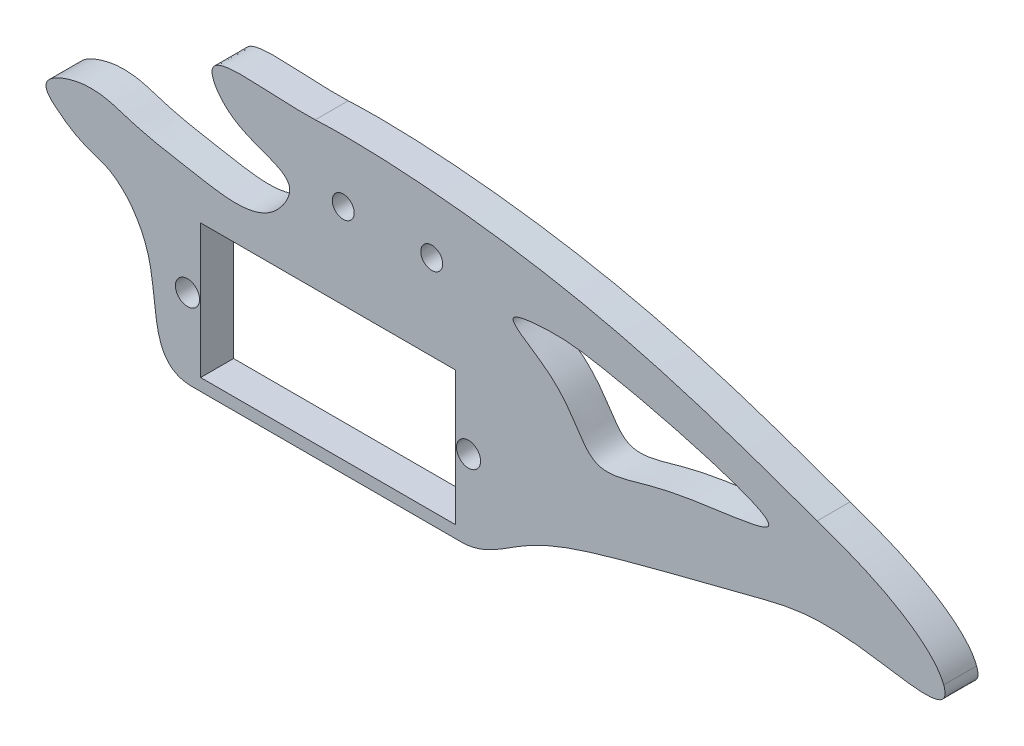
ISO-10303-21;
HEADER;
FILE_DESCRIPTION(('STEP AP214'),'2;1');
FILE_NAME('part.step','',(''),(''),'','','');
FILE_SCHEMA(('AUTOMOTIVE_DESIGN { 1 0 10303 214 1 1 1 1 }'));
ENDSEC;
DATA;
#1=APPLICATION_CONTEXT('core data for automotive mechanical design processes');
#2=APPLICATION_PROTOCOL_DEFINITION('international standard','automotive_design',2000,#1);
#3=PRODUCT_CONTEXT('',#1,'mechanical');
#4=PRODUCT('Part','Part','',(#3));
#5=PRODUCT_RELATED_PRODUCT_CATEGORY('part','',(#4));
#6=PRODUCT_DEFINITION_FORMATION('','',#4);
#7=PRODUCT_DEFINITION_CONTEXT('part definition',#1,'design');
#8=PRODUCT_DEFINITION('design','',#6,#7);
#9=PRODUCT_DEFINITION_SHAPE('','',#8);
#10=(LENGTH_UNIT() NAMED_UNIT(*) SI_UNIT(.MILLI.,.METRE.));
#11=(NAMED_UNIT(*) PLANE_ANGLE_UNIT() SI_UNIT($,.RADIAN.));
#12=(NAMED_UNIT(*) SI_UNIT($,.STERADIAN.) SOLID_ANGLE_UNIT());
#13=UNCERTAINTY_MEASURE_WITH_UNIT(LENGTH_MEASURE(1.E-05),#10,'distance_accuracy_value','');
#14=(GEOMETRIC_REPRESENTATION_CONTEXT(3) GLOBAL_UNCERTAINTY_ASSIGNED_CONTEXT((#13)) GLOBAL_UNIT_ASSIGNED_CONTEXT((#10,
#11,#12)) REPRESENTATION_CONTEXT('',''));
#15=CARTESIAN_POINT('',(0.,0.,0.));
#16=DIRECTION('',(0.,0.,1.));
#17=DIRECTION('',(1.,0.,0.));
#18=AXIS2_PLACEMENT_3D('',#15,#16,#17);
#19=CARTESIAN_POINT('',(50.945737202946,7.92025804902963,3.));
#20=DIRECTION('',(0.,0.,-1.));
#21=DIRECTION('',(-1.,0.,0.));
#22=AXIS2_PLACEMENT_3D('',#19,#20,#21);
#23=PLANE('',#22);
#24=CARTESIAN_POINT('',(1.49213528823466,13.7349483060092,3.));
#25=DIRECTION('',(0.,0.,1.));
#26=DIRECTION('',(1.,0.,0.));
#27=AXIS2_PLACEMENT_3D('',#24,#25,#26);
#28=CIRCLE('',#27,1.);
#29=CARTESIAN_POINT('',(2.49213528823466,13.7349483060092,3.));
#30=VERTEX_POINT('',#29);
#31=EDGE_CURVE('E265',#30,#30,#28,.T.);
#32=ORIENTED_EDGE('',*,*,#31,.F.);
#33=EDGE_LOOP('',(#32));
#34=FACE_BOUND('',#33,.T.);
#35=CARTESIAN_POINT('',(12.902215369931,-0.0886051950729563,3.));
#36=DIRECTION('',(0.,0.,1.));
#37=DIRECTION('',(1.,0.,0.));
#38=AXIS2_PLACEMENT_3D('',#35,#36,#37);
#39=CIRCLE('',#38,1.1);
#40=CARTESIAN_POINT('',(14.002215369931,-0.0886051950729563,3.));
#41=VERTEX_POINT('',#40);
#42=EDGE_CURVE('E266',#41,#41,#39,.T.);
#43=ORIENTED_EDGE('',*,*,#42,.F.);
#44=EDGE_LOOP('',(#43));
#45=FACE_BOUND('',#44,.T.);
#46=DIRECTION('',(0.,1.,0.));
#47=VECTOR('',#46,1.);
#48=CARTESIAN_POINT('',(11.702215369931,5.96014949742974,3.));
#49=LINE('',#48,#47);
#50=CARTESIAN_POINT('',(11.702215369931,-6.23985050257025,3.));
#51=VERTEX_POINT('',#50);
#52=CARTESIAN_POINT('',(11.702215369931,5.96014949742974,3.));
#53=VERTEX_POINT('',#52);
#54=EDGE_CURVE('E113',#51,#53,#49,.T.);
#55=ORIENTED_EDGE('',*,*,#54,.F.);
#56=DIRECTION('',(1.,0.,0.));
#57=VECTOR('',#56,1.);
#58=CARTESIAN_POINT('',(-11.497784630069,-6.23985050257025,3.));
#59=LINE('',#58,#57);
#60=CARTESIAN_POINT('',(-11.497784630069,-6.23985050257025,3.));
#61=VERTEX_POINT('',#60);
#62=EDGE_CURVE('E136',#61,#51,#59,.T.);
#63=ORIENTED_EDGE('',*,*,#62,.F.);
#64=DIRECTION('',(0.,-1.,0.));
#65=VECTOR('',#64,1.);
#66=CARTESIAN_POINT('',(-11.497784630069,5.96014949742974,3.));
#67=LINE('',#66,#65);
#68=CARTESIAN_POINT('',(-11.497784630069,5.96014949742974,3.));
#69=VERTEX_POINT('',#68);
#70=EDGE_CURVE('E134',#69,#61,#67,.T.);
#71=ORIENTED_EDGE('',*,*,#70,.F.);
#72=DIRECTION('',(-1.,0.,0.));
#73=VECTOR('',#72,1.);
#74=CARTESIAN_POINT('',(-11.497784630069,5.96014949742974,3.));
#75=LINE('',#74,#73);
#76=EDGE_CURVE('E121',#53,#69,#75,.T.);
#77=ORIENTED_EDGE('',*,*,#76,.F.);
#78=EDGE_LOOP('',(#55,#63,#71,#77));
#79=FACE_BOUND('',#78,.T.);
#80=CARTESIAN_POINT('',(56.1831132738071,3.358042912609,3.));
#81=CARTESIAN_POINT('',(55.5953874618182,4.91224606206585,3.));
#82=CARTESIAN_POINT('',(51.2723508976573,8.22516742618063,3.));
#83=CARTESIAN_POINT('',(46.4981315187929,9.86752714739411,3.));
#84=CARTESIAN_POINT('',(44.6645883353901,10.5328891610297,3.));
#85=B_SPLINE_CURVE_WITH_KNOTS('',3,(#80,#81,#82,#83,#84),.UNSPECIFIED.,.F.,.F.,(4,1,4),(0.,
0.453084553517505,1.),.UNSPECIFIED.);
#86=CARTESIAN_POINT('',(56.1831132738071,3.35804291260899,3.));
#87=VERTEX_POINT('',#86);
#88=CARTESIAN_POINT('',(44.6645883353901,10.5328891610297,3.));
#89=VERTEX_POINT('',#88);
#90=EDGE_CURVE('E151',#87,#89,#85,.T.);
#91=ORIENTED_EDGE('',*,*,#90,.T.);
#92=CARTESIAN_POINT('',(44.6645883353901,10.5328891610297,3.));
#93=CARTESIAN_POINT('',(34.6116640461838,14.180926473998,3.));
#94=CARTESIAN_POINT('',(22.9474187358334,18.0856965781917,3.));
#95=CARTESIAN_POINT('',(3.90717034719163,19.545851194065,3.));
#96=CARTESIAN_POINT('',(-1.05517591234162,19.315596614959,3.));
#97=B_SPLINE_CURVE_WITH_KNOTS('',3,(#92,#93,#94,#95,#96),.UNSPECIFIED.,.F.,.F.,(4,1,4),(0.,
0.663075295395833,0.975069148618701),.UNSPECIFIED.);
#98=CARTESIAN_POINT('',(-1.05517591234161,19.315596614959,3.));
#99=VERTEX_POINT('',#98);
#100=EDGE_CURVE('E157',#89,#99,#97,.T.);
#101=ORIENTED_EDGE('',*,*,#100,.T.);
#102=CARTESIAN_POINT('',(-1.05517591234161,19.315596614959,3.));
#103=CARTESIAN_POINT('',(-1.88948310834742,19.2768844731183,3.));
#104=CARTESIAN_POINT('',(-5.40186748250664,19.3477042964518,3.));
#105=CARTESIAN_POINT('',(-11.8338547523832,19.8519774435686,3.));
#106=CARTESIAN_POINT('',(-8.3136843958791,14.3073738264427,3.));
#107=CARTESIAN_POINT('',(-2.0219609609858,14.1708769211604,3.));
#108=CARTESIAN_POINT('',(-5.63844138613879,8.31372385548729,3.));
#109=CARTESIAN_POINT('',(-11.6499678708116,9.58025219400274,3.));
#110=CARTESIAN_POINT('',(-17.3554350943542,10.4574002200955,3.));
#111=CARTESIAN_POINT('',(-21.4747622228726,12.1970732505788,3.));
#112=CARTESIAN_POINT('',(-26.2148455445505,10.406096991954,3.));
#113=CARTESIAN_POINT('',(-25.4266198847626,9.11473818169934,3.));
#114=CARTESIAN_POINT('',(-24.8462595011324,8.61419043548911,3.));
#115=B_SPLINE_CURVE_WITH_KNOTS('',3,(#102,#103,#104,#105,#106,#107,#108,#109,#110,#111,#112,
#113,#114),.UNSPECIFIED.,.F.,.F.,(4,1,1,1,1,1,1,1,1,1,4),(0.,0.0703623859860327,
0.155384077242886,0.208376842008789,0.311744431044371,0.352432054861618,0.476857560000144,
0.569052151292182,0.643479446502062,0.705243667990706,0.74335408170189),.UNSPECIFIED.);
#116=CARTESIAN_POINT('',(-24.8462595011324,8.61419043548911,3.));
#117=VERTEX_POINT('',#116);
#118=EDGE_CURVE('E166',#99,#117,#115,.T.);
#119=ORIENTED_EDGE('',*,*,#118,.T.);
#120=CARTESIAN_POINT('',(-24.8462595011324,8.61419043548911,3.));
#121=CARTESIAN_POINT('',(-22.4373333645532,6.53654595378009,3.));
#122=CARTESIAN_POINT('',(-19.7453925325917,6.86890331942398,3.));
#123=CARTESIAN_POINT('',(-14.6618002114323,0.558315148710704,3.));
#124=CARTESIAN_POINT('',(-16.2145008353178,-7.34533507774415,3.));
#125=CARTESIAN_POINT('',(-12.2353374274979,-7.34533507774415,3.));
#126=B_SPLINE_CURVE_WITH_KNOTS('',3,(#120,#121,#122,#123,#124,#125),.UNSPECIFIED.,.F.,.F.,(4,1,
1,4),(0.,0.27026059378441,0.562833548892506,1.),.UNSPECIFIED.);
#127=CARTESIAN_POINT('',(-12.2353374274979,-7.34533507774415,3.));
#128=VERTEX_POINT('',#127);
#129=EDGE_CURVE('E188',#117,#128,#126,.T.);
#130=ORIENTED_EDGE('',*,*,#129,.T.);
#131=DIRECTION('',(1.,0.,0.));
#132=VECTOR('',#131,1.);
#133=CARTESIAN_POINT('',(12.2651528203406,-7.34533507774415,3.));
#134=LINE('',#133,#132);
#135=CARTESIAN_POINT('',(12.2651528203406,-7.34533507774415,3.));
#136=VERTEX_POINT('',#135);
#137=EDGE_CURVE('E193',#128,#136,#134,.T.);
#138=ORIENTED_EDGE('',*,*,#137,.T.);
#139=CARTESIAN_POINT('',(12.2651528203406,-7.34533507774415,3.));
#140=CARTESIAN_POINT('',(14.2904278782216,-7.34533507774415,3.));
#141=CARTESIAN_POINT('',(18.2040630407627,-4.14770521824105,3.));
#142=CARTESIAN_POINT('',(26.7333358242006,-1.307892393372,3.));
#143=CARTESIAN_POINT('',(38.5435156675437,1.44511694943197,3.));
#144=CARTESIAN_POINT('',(45.6439913745482,3.61538719289042,3.));
#145=CARTESIAN_POINT('',(57.0991338685693,0.935685302469306,3.));
#146=CARTESIAN_POINT('',(56.1831132738071,3.35804291260899,3.));
#147=B_SPLINE_CURVE_WITH_KNOTS('',3,(#139,#140,#141,#142,#143,#144,#145,#146),.UNSPECIFIED.,.F.,
.F.,(4,1,1,1,1,4),(0.,0.131306772745805,0.304515494205062,0.607289140943436,0.857344902436835,
1.),.UNSPECIFIED.);
#148=EDGE_CURVE('E198',#136,#87,#147,.T.);
#149=ORIENTED_EDGE('',*,*,#148,.T.);
#150=EDGE_LOOP('',(#91,#101,#119,#130,#138,#149));
#151=FACE_BOUND('',#150,.T.);
#152=CARTESIAN_POINT('',(-12.697784630069,-0.139850502556578,3.));
#153=DIRECTION('',(0.,0.,1.));
#154=DIRECTION('',(1.,0.,0.));
#155=AXIS2_PLACEMENT_3D('',#152,#153,#154);
#156=CIRCLE('',#155,1.1);
#157=CARTESIAN_POINT('',(-11.597784630069,-0.139850502556578,3.));
#158=VERTEX_POINT('',#157);
#159=EDGE_CURVE('E142',#158,#158,#156,.T.);
#160=ORIENTED_EDGE('',*,*,#159,.F.);
#161=EDGE_LOOP('',(#160));
#162=FACE_BOUND('',#161,.T.);
#163=CARTESIAN_POINT('',(24.5651895533299,5.02476845113393,3.));
#164=CARTESIAN_POINT('',(25.8691758354171,4.45549585054901,3.));
#165=CARTESIAN_POINT('',(31.3965571677924,6.84154219397598,3.));
#166=CARTESIAN_POINT('',(46.2778617879884,7.29520377668101,3.));
#167=CARTESIAN_POINT('',(31.2685266514485,11.5755719024659,3.));
#168=CARTESIAN_POINT('',(24.7743364383091,12.9065150914853,3.));
#169=CARTESIAN_POINT('',(21.0779183817403,13.5586912917861,3.));
#170=CARTESIAN_POINT('',(15.2259187858026,12.8100262320131,3.));
#171=CARTESIAN_POINT('',(22.1719233053227,9.59241206191493,3.));
#172=CARTESIAN_POINT('',(23.1533286570867,5.64113515307652,3.));
#173=CARTESIAN_POINT('',(24.5651895533299,5.02476845113393,3.));
#174=B_SPLINE_CURVE_WITH_KNOTS('',3,(#163,#164,#165,#166,#167,#168,#169,#170,#171,#172,#173),
.UNSPECIFIED.,.T.,.F.,(4,1,1,1,1,1,1,1,4),(0.,0.114686734911515,0.313852210876247,
0.537605762144113,0.626373914783709,0.737466002755453,0.787216229185245,0.875825598348942,1.),.UNSPECIFIED.);
#175=CARTESIAN_POINT('',(24.5651895533299,5.02476845113393,3.));
#176=VERTEX_POINT('',#175);
#177=EDGE_CURVE('E247',#176,#176,#174,.T.);
#178=ORIENTED_EDGE('',*,*,#177,.F.);
#179=EDGE_LOOP('',(#178));
#180=FACE_BOUND('',#179,.T.);
#181=CARTESIAN_POINT('',(9.55219899903703,13.7349483060092,3.));
#182=DIRECTION('',(0.,0.,1.));
#183=DIRECTION('',(1.,0.,0.));
#184=AXIS2_PLACEMENT_3D('',#181,#182,#183);
#185=CIRCLE('',#184,1.);
#186=CARTESIAN_POINT('',(10.552198999037,13.7349483060092,3.));
#187=VERTEX_POINT('',#186);
#188=EDGE_CURVE('E287',#187,#187,#185,.T.);
#189=ORIENTED_EDGE('',*,*,#188,.F.);
#190=EDGE_LOOP('',(#189));
#191=FACE_BOUND('',#190,.T.);
#192=ADVANCED_FACE('F35',(#34,#45,#79,#151,#162,#180,#191),#23,.F.);
#193=CARTESIAN_POINT('',(50.945737202946,7.92025804902963,0.));
#194=DIRECTION('',(0.,0.,-1.));
#195=DIRECTION('',(-1.,0.,0.));
#196=AXIS2_PLACEMENT_3D('',#193,#194,#195);
#197=PLANE('',#196);
#198=CARTESIAN_POINT('',(1.49213528823466,13.7349483060092,0.));
#199=DIRECTION('',(0.,0.,1.));
#200=DIRECTION('',(1.,0.,0.));
#201=AXIS2_PLACEMENT_3D('',#198,#199,#200);
#202=CIRCLE('',#201,1.);
#203=CARTESIAN_POINT('',(2.49213528823466,13.7349483060092,0.));
#204=VERTEX_POINT('',#203);
#205=EDGE_CURVE('E256',#204,#204,#202,.T.);
#206=ORIENTED_EDGE('',*,*,#205,.T.);
#207=EDGE_LOOP('',(#206));
#208=FACE_BOUND('',#207,.T.);
#209=CARTESIAN_POINT('',(12.902215369931,-0.0886051950729563,0.));
#210=DIRECTION('',(0.,0.,1.));
#211=DIRECTION('',(1.,0.,0.));
#212=AXIS2_PLACEMENT_3D('',#209,#210,#211);
#213=CIRCLE('',#212,1.1);
#214=CARTESIAN_POINT('',(14.002215369931,-0.0886051950729563,0.));
#215=VERTEX_POINT('',#214);
#216=EDGE_CURVE('E254',#215,#215,#213,.T.);
#217=ORIENTED_EDGE('',*,*,#216,.T.);
#218=EDGE_LOOP('',(#217));
#219=FACE_BOUND('',#218,.T.);
#220=DIRECTION('',(1.,0.,0.));
#221=VECTOR('',#220,1.);
#222=CARTESIAN_POINT('',(-11.497784630069,-6.23985050257025,0.));
#223=LINE('',#222,#221);
#224=CARTESIAN_POINT('',(-11.497784630069,-6.23985050257025,0.));
#225=VERTEX_POINT('',#224);
#226=CARTESIAN_POINT('',(11.702215369931,-6.23985050257025,0.));
#227=VERTEX_POINT('',#226);
#228=EDGE_CURVE('E122',#225,#227,#223,.T.);
#229=ORIENTED_EDGE('',*,*,#228,.T.);
#230=DIRECTION('',(0.,1.,0.));
#231=VECTOR('',#230,1.);
#232=CARTESIAN_POINT('',(11.702215369931,5.96014949742974,0.));
#233=LINE('',#232,#231);
#234=CARTESIAN_POINT('',(11.702215369931,5.96014949742974,0.));
#235=VERTEX_POINT('',#234);
#236=EDGE_CURVE('E59',#227,#235,#233,.T.);
#237=ORIENTED_EDGE('',*,*,#236,.T.);
#238=DIRECTION('',(-1.,0.,0.));
#239=VECTOR('',#238,1.);
#240=CARTESIAN_POINT('',(-11.497784630069,5.96014949742974,0.));
#241=LINE('',#240,#239);
#242=CARTESIAN_POINT('',(-11.497784630069,5.96014949742974,0.));
#243=VERTEX_POINT('',#242);
#244=EDGE_CURVE('E128',#235,#243,#241,.T.);
#245=ORIENTED_EDGE('',*,*,#244,.T.);
#246=DIRECTION('',(0.,-1.,0.));
#247=VECTOR('',#246,1.);
#248=CARTESIAN_POINT('',(-11.497784630069,5.96014949742974,0.));
#249=LINE('',#248,#247);
#250=EDGE_CURVE('E144',#243,#225,#249,.T.);
#251=ORIENTED_EDGE('',*,*,#250,.T.);
#252=EDGE_LOOP('',(#229,#237,#245,#251));
#253=FACE_BOUND('',#252,.T.);
#254=CARTESIAN_POINT('',(56.1831132738071,3.358042912609,0.));
#255=CARTESIAN_POINT('',(55.5953874618182,4.91224606206585,0.));
#256=CARTESIAN_POINT('',(51.2723508976573,8.22516742618063,0.));
#257=CARTESIAN_POINT('',(46.4981315187929,9.86752714739411,0.));
#258=CARTESIAN_POINT('',(44.6645883353901,10.5328891610297,0.));
#259=B_SPLINE_CURVE_WITH_KNOTS('',3,(#254,#255,#256,#257,#258),.UNSPECIFIED.,.F.,.F.,(4,1,4),
(0.,0.453084553517505,1.),.UNSPECIFIED.);
#260=CARTESIAN_POINT('',(56.1831132738071,3.35804291260899,0.));
#261=VERTEX_POINT('',#260);
#262=CARTESIAN_POINT('',(44.6645883353901,10.5328891610297,0.));
#263=VERTEX_POINT('',#262);
#264=EDGE_CURVE('E129',#261,#263,#259,.T.);
#265=ORIENTED_EDGE('',*,*,#264,.F.);
#266=CARTESIAN_POINT('',(12.2651528203406,-7.34533507774415,0.));
#267=CARTESIAN_POINT('',(14.2904278782216,-7.34533507774415,0.));
#268=CARTESIAN_POINT('',(18.2040630407627,-4.14770521824105,0.));
#269=CARTESIAN_POINT('',(26.7333358242006,-1.307892393372,0.));
#270=CARTESIAN_POINT('',(38.5435156675437,1.44511694943197,0.));
#271=CARTESIAN_POINT('',(45.6439913745482,3.61538719289042,0.));
#272=CARTESIAN_POINT('',(57.0991338685693,0.935685302469306,0.));
#273=CARTESIAN_POINT('',(56.1831132738071,3.35804291260899,0.));
#274=B_SPLINE_CURVE_WITH_KNOTS('',3,(#266,#267,#268,#269,#270,#271,#272,#273),.UNSPECIFIED.,.F.,
.F.,(4,1,1,1,1,4),(0.,0.131306772745805,0.304515494205062,0.607289140943436,0.857344902436835,
1.),.UNSPECIFIED.);
#275=CARTESIAN_POINT('',(12.2651528203406,-7.34533507774415,0.));
#276=VERTEX_POINT('',#275);
#277=EDGE_CURVE('E158',#276,#261,#274,.T.);
#278=ORIENTED_EDGE('',*,*,#277,.F.);
#279=DIRECTION('',(1.,0.,0.));
#280=VECTOR('',#279,1.);
#281=CARTESIAN_POINT('',(12.2651528203406,-7.34533507774415,0.));
#282=LINE('',#281,#280);
#283=CARTESIAN_POINT('',(-12.2353374274979,-7.34533507774415,0.));
#284=VERTEX_POINT('',#283);
#285=EDGE_CURVE('E438',#284,#276,#282,.T.);
#286=ORIENTED_EDGE('',*,*,#285,.F.);
#287=CARTESIAN_POINT('',(-24.8462595011324,8.61419043548911,0.));
#288=CARTESIAN_POINT('',(-22.4373333645532,6.53654595378009,0.));
#289=CARTESIAN_POINT('',(-19.7453925325917,6.86890331942398,0.));
#290=CARTESIAN_POINT('',(-14.6618002114323,0.558315148710704,0.));
#291=CARTESIAN_POINT('',(-16.2145008353178,-7.34533507774415,0.));
#292=CARTESIAN_POINT('',(-12.2353374274979,-7.34533507774415,0.));
#293=B_SPLINE_CURVE_WITH_KNOTS('',3,(#287,#288,#289,#290,#291,#292),.UNSPECIFIED.,.F.,.F.,(4,1,
1,4),(0.,0.27026059378441,0.562833548892506,1.),.UNSPECIFIED.);
#294=CARTESIAN_POINT('',(-24.8462595011324,8.61419043548911,0.));
#295=VERTEX_POINT('',#294);
#296=EDGE_CURVE('E422',#295,#284,#293,.T.);
#297=ORIENTED_EDGE('',*,*,#296,.F.);
#298=CARTESIAN_POINT('',(-1.05517591234161,19.315596614959,0.));
#299=CARTESIAN_POINT('',(-1.88948310834742,19.2768844731183,0.));
#300=CARTESIAN_POINT('',(-5.40186748250664,19.3477042964518,0.));
#301=CARTESIAN_POINT('',(-11.8338547523832,19.8519774435686,0.));
#302=CARTESIAN_POINT('',(-8.3136843958791,14.3073738264427,0.));
#303=CARTESIAN_POINT('',(-2.0219609609858,14.1708769211604,0.));
#304=CARTESIAN_POINT('',(-5.63844138613879,8.31372385548729,0.));
#305=CARTESIAN_POINT('',(-11.6499678708116,9.58025219400274,0.));
#306=CARTESIAN_POINT('',(-17.3554350943542,10.4574002200955,0.));
#307=CARTESIAN_POINT('',(-21.4747622228726,12.1970732505788,0.));
#308=CARTESIAN_POINT('',(-26.2148455445505,10.406096991954,0.));
#309=CARTESIAN_POINT('',(-25.4266198847626,9.11473818169934,0.));
#310=CARTESIAN_POINT('',(-24.8462595011324,8.61419043548911,0.));
#311=B_SPLINE_CURVE_WITH_KNOTS('',3,(#298,#299,#300,#301,#302,#303,#304,#305,#306,#307,#308,
#309,#310),.UNSPECIFIED.,.F.,.F.,(4,1,1,1,1,1,1,1,1,1,4),(0.,0.0703623859860327,
0.155384077242886,0.208376842008789,0.311744431044371,0.352432054861618,0.476857560000144,
0.569052151292182,0.643479446502062,0.705243667990706,0.74335408170189),.UNSPECIFIED.);
#312=CARTESIAN_POINT('',(-1.05517591234161,19.315596614959,0.));
#313=VERTEX_POINT('',#312);
#314=EDGE_CURVE('E419',#313,#295,#311,.T.);
#315=ORIENTED_EDGE('',*,*,#314,.F.);
#316=CARTESIAN_POINT('',(44.6645883353901,10.5328891610297,0.));
#317=CARTESIAN_POINT('',(34.6116640461838,14.180926473998,0.));
#318=CARTESIAN_POINT('',(22.9474187358334,18.0856965781917,0.));
#319=CARTESIAN_POINT('',(3.90717034719163,19.545851194065,0.));
#320=CARTESIAN_POINT('',(-1.05517591234162,19.315596614959,0.));
#321=B_SPLINE_CURVE_WITH_KNOTS('',3,(#316,#317,#318,#319,#320),.UNSPECIFIED.,.F.,.F.,(4,1,4),
(0.,0.663075295395833,0.975069148618701),.UNSPECIFIED.);
#322=EDGE_CURVE('E418',#263,#313,#321,.T.);
#323=ORIENTED_EDGE('',*,*,#322,.F.);
#324=EDGE_LOOP('',(#265,#278,#286,#297,#315,#323));
#325=FACE_BOUND('',#324,.T.);
#326=CARTESIAN_POINT('',(-12.697784630069,-0.139850502556578,0.));
#327=DIRECTION('',(0.,0.,1.));
#328=DIRECTION('',(1.,0.,0.));
#329=AXIS2_PLACEMENT_3D('',#326,#327,#328);
#330=CIRCLE('',#329,1.1);
#331=CARTESIAN_POINT('',(-11.597784630069,-0.139850502556578,0.));
#332=VERTEX_POINT('',#331);
#333=EDGE_CURVE('E272',#332,#332,#330,.T.);
#334=ORIENTED_EDGE('',*,*,#333,.T.);
#335=EDGE_LOOP('',(#334));
#336=FACE_BOUND('',#335,.T.);
#337=CARTESIAN_POINT('',(24.5651895533299,5.02476845113393,0.));
#338=CARTESIAN_POINT('',(25.8691758354171,4.45549585054901,0.));
#339=CARTESIAN_POINT('',(31.3965571677924,6.84154219397598,0.));
#340=CARTESIAN_POINT('',(46.2778617879884,7.29520377668101,0.));
#341=CARTESIAN_POINT('',(31.2685266514485,11.5755719024659,0.));
#342=CARTESIAN_POINT('',(24.7743364383091,12.9065150914853,0.));
#343=CARTESIAN_POINT('',(21.0779183817403,13.5586912917861,0.));
#344=CARTESIAN_POINT('',(15.2259187858026,12.8100262320131,0.));
#345=CARTESIAN_POINT('',(22.1719233053227,9.59241206191493,0.));
#346=CARTESIAN_POINT('',(23.1533286570867,5.64113515307652,0.));
#347=CARTESIAN_POINT('',(24.5651895533299,5.02476845113393,0.));
#348=B_SPLINE_CURVE_WITH_KNOTS('',3,(#337,#338,#339,#340,#341,#342,#343,#344,#345,#346,#347),
.UNSPECIFIED.,.T.,.F.,(4,1,1,1,1,1,1,1,4),(0.,0.114686734911515,0.313852210876247,
0.537605762144113,0.626373914783709,0.737466002755453,0.787216229185245,0.875825598348942,1.),.UNSPECIFIED.);
#349=CARTESIAN_POINT('',(24.5651895533299,5.02476845113393,0.));
#350=VERTEX_POINT('',#349);
#351=EDGE_CURVE('E255',#350,#350,#348,.T.);
#352=ORIENTED_EDGE('',*,*,#351,.T.);
#353=EDGE_LOOP('',(#352));
#354=FACE_BOUND('',#353,.T.);
#355=CARTESIAN_POINT('',(9.55219899903703,13.7349483060092,0.));
#356=DIRECTION('',(0.,0.,1.));
#357=DIRECTION('',(1.,0.,0.));
#358=AXIS2_PLACEMENT_3D('',#355,#356,#357);
#359=CIRCLE('',#358,1.);
#360=CARTESIAN_POINT('',(10.552198999037,13.7349483060092,0.));
#361=VERTEX_POINT('',#360);
#362=EDGE_CURVE('E285',#361,#361,#359,.T.);
#363=ORIENTED_EDGE('',*,*,#362,.T.);
#364=EDGE_LOOP('',(#363));
#365=FACE_BOUND('',#364,.T.);
#366=ADVANCED_FACE('F214',(#208,#219,#253,#325,#336,#354,#365),#197,.T.);
#367=DIRECTION('',(0.,0.,-1.));
#368=VECTOR('',#367,1.);
#369=SURFACE_OF_LINEAR_EXTRUSION('',#85,#368);
#370=ORIENTED_EDGE('',*,*,#264,.T.);
#371=DIRECTION('',(0.,0.,-1.));
#372=VECTOR('',#371,1.);
#373=CARTESIAN_POINT('',(44.6645883353901,10.5328891610297,3.));
#374=LINE('',#373,#372);
#375=EDGE_CURVE('E11',#89,#263,#374,.T.);
#376=ORIENTED_EDGE('',*,*,#375,.F.);
#377=ORIENTED_EDGE('',*,*,#90,.F.);
#378=DIRECTION('',(0.,0.,-1.));
#379=VECTOR('',#378,1.);
#380=CARTESIAN_POINT('',(56.1831132738071,3.35804291260899,3.));
#381=LINE('',#380,#379);
#382=EDGE_CURVE('E203',#87,#261,#381,.T.);
#383=ORIENTED_EDGE('',*,*,#382,.T.);
#384=EDGE_LOOP('',(#370,#376,#377,#383));
#385=FACE_BOUND('',#384,.T.);
#386=ADVANCED_FACE('F37',(#385),#369,.F.);
#387=DIRECTION('',(0.,0.,-1.));
#388=VECTOR('',#387,1.);
#389=SURFACE_OF_LINEAR_EXTRUSION('',#97,#388);
#390=ORIENTED_EDGE('',*,*,#322,.T.);
#391=DIRECTION('',(0.,0.,-1.));
#392=VECTOR('',#391,1.);
#393=CARTESIAN_POINT('',(-1.05517591234161,19.315596614959,3.));
#394=LINE('',#393,#392);
#395=EDGE_CURVE('E44',#99,#313,#394,.T.);
#396=ORIENTED_EDGE('',*,*,#395,.F.);
#397=ORIENTED_EDGE('',*,*,#100,.F.);
#398=ORIENTED_EDGE('',*,*,#375,.T.);
#399=EDGE_LOOP('',(#390,#396,#397,#398));
#400=FACE_BOUND('',#399,.T.);
#401=ADVANCED_FACE('F174',(#400),#389,.F.);
#402=DIRECTION('',(0.,0.,-1.));
#403=VECTOR('',#402,1.);
#404=SURFACE_OF_LINEAR_EXTRUSION('',#115,#403);
#405=ORIENTED_EDGE('',*,*,#314,.T.);
#406=DIRECTION('',(0.,0.,-1.));
#407=VECTOR('',#406,1.);
#408=CARTESIAN_POINT('',(-24.8462595011324,8.61419043548911,3.));
#409=LINE('',#408,#407);
#410=EDGE_CURVE('E456',#117,#295,#409,.T.);
#411=ORIENTED_EDGE('',*,*,#410,.F.);
#412=ORIENTED_EDGE('',*,*,#118,.F.);
#413=ORIENTED_EDGE('',*,*,#395,.T.);
#414=EDGE_LOOP('',(#405,#411,#412,#413));
#415=FACE_BOUND('',#414,.T.);
#416=ADVANCED_FACE('F177',(#415),#404,.F.);
#417=DIRECTION('',(0.,0.,-1.));
#418=VECTOR('',#417,1.);
#419=SURFACE_OF_LINEAR_EXTRUSION('',#126,#418);
#420=ORIENTED_EDGE('',*,*,#296,.T.);
#421=DIRECTION('',(0.,0.,-1.));
#422=VECTOR('',#421,1.);
#423=CARTESIAN_POINT('',(-12.2353374274979,-7.34533507774415,3.));
#424=LINE('',#423,#422);
#425=EDGE_CURVE('E453',#128,#284,#424,.T.);
#426=ORIENTED_EDGE('',*,*,#425,.F.);
#427=ORIENTED_EDGE('',*,*,#129,.F.);
#428=ORIENTED_EDGE('',*,*,#410,.T.);
#429=EDGE_LOOP('',(#420,#426,#427,#428));
#430=FACE_BOUND('',#429,.T.);
#431=ADVANCED_FACE('F181',(#430),#419,.F.);
#432=CARTESIAN_POINT('',(12.2651528203406,-7.34533507774415,3.));
#433=DIRECTION('',(0.,1.,0.));
#434=DIRECTION('',(0.,0.,1.));
#435=AXIS2_PLACEMENT_3D('',#432,#433,#434);
#436=PLANE('',#435);
#437=ORIENTED_EDGE('',*,*,#285,.T.);
#438=DIRECTION('',(0.,0.,-1.));
#439=VECTOR('',#438,1.);
#440=CARTESIAN_POINT('',(12.2651528203406,-7.34533507774415,3.));
#441=LINE('',#440,#439);
#442=EDGE_CURVE('E450',#136,#276,#441,.T.);
#443=ORIENTED_EDGE('',*,*,#442,.F.);
#444=ORIENTED_EDGE('',*,*,#137,.F.);
#445=ORIENTED_EDGE('',*,*,#425,.T.);
#446=EDGE_LOOP('',(#437,#443,#444,#445));
#447=FACE_BOUND('',#446,.T.);
#448=ADVANCED_FACE('F185',(#447),#436,.F.);
#449=DIRECTION('',(0.,0.,-1.));
#450=VECTOR('',#449,1.);
#451=SURFACE_OF_LINEAR_EXTRUSION('',#147,#450);
#452=ORIENTED_EDGE('',*,*,#277,.T.);
#453=ORIENTED_EDGE('',*,*,#382,.F.);
#454=ORIENTED_EDGE('',*,*,#148,.F.);
#455=ORIENTED_EDGE('',*,*,#442,.T.);
#456=EDGE_LOOP('',(#452,#453,#454,#455));
#457=FACE_BOUND('',#456,.T.);
#458=ADVANCED_FACE('F210',(#457),#451,.F.);
#459=CARTESIAN_POINT('',(11.702215369931,5.96014949742974,3.));
#460=DIRECTION('',(-1.,0.,0.));
#461=DIRECTION('',(0.,-1.,0.));
#462=AXIS2_PLACEMENT_3D('',#459,#460,#461);
#463=PLANE('',#462);
#464=ORIENTED_EDGE('',*,*,#236,.F.);
#465=DIRECTION('',(0.,0.,-1.));
#466=VECTOR('',#465,1.);
#467=CARTESIAN_POINT('',(11.702215369931,-6.23985050257025,3.));
#468=LINE('',#467,#466);
#469=EDGE_CURVE('E117',#51,#227,#468,.T.);
#470=ORIENTED_EDGE('',*,*,#469,.F.);
#471=ORIENTED_EDGE('',*,*,#54,.T.);
#472=DIRECTION('',(0.,0.,-1.));
#473=VECTOR('',#472,1.);
#474=CARTESIAN_POINT('',(11.702215369931,5.96014949742974,3.));
#475=LINE('',#474,#473);
#476=EDGE_CURVE('E116',#53,#235,#475,.T.);
#477=ORIENTED_EDGE('',*,*,#476,.T.);
#478=EDGE_LOOP('',(#464,#470,#471,#477));
#479=FACE_BOUND('',#478,.T.);
#480=ADVANCED_FACE('F115',(#479),#463,.T.);
#481=CARTESIAN_POINT('',(-11.497784630069,5.96014949742974,3.));
#482=DIRECTION('',(0.,-1.,0.));
#483=DIRECTION('',(0.,0.,-1.));
#484=AXIS2_PLACEMENT_3D('',#481,#482,#483);
#485=PLANE('',#484);
#486=ORIENTED_EDGE('',*,*,#244,.F.);
#487=ORIENTED_EDGE('',*,*,#476,.F.);
#488=ORIENTED_EDGE('',*,*,#76,.T.);
#489=DIRECTION('',(0.,0.,-1.));
#490=VECTOR('',#489,1.);
#491=CARTESIAN_POINT('',(-11.497784630069,5.96014949742974,3.));
#492=LINE('',#491,#490);
#493=EDGE_CURVE('E130',#69,#243,#492,.T.);
#494=ORIENTED_EDGE('',*,*,#493,.T.);
#495=EDGE_LOOP('',(#486,#487,#488,#494));
#496=FACE_BOUND('',#495,.T.);
#497=ADVANCED_FACE('F125',(#496),#485,.T.);
#498=CARTESIAN_POINT('',(-11.497784630069,5.96014949742974,3.));
#499=DIRECTION('',(1.,0.,0.));
#500=DIRECTION('',(0.,0.,-1.));
#501=AXIS2_PLACEMENT_3D('',#498,#499,#500);
#502=PLANE('',#501);
#503=ORIENTED_EDGE('',*,*,#250,.F.);
#504=ORIENTED_EDGE('',*,*,#493,.F.);
#505=ORIENTED_EDGE('',*,*,#70,.T.);
#506=DIRECTION('',(0.,0.,-1.));
#507=VECTOR('',#506,1.);
#508=CARTESIAN_POINT('',(-11.497784630069,-6.23985050257025,3.));
#509=LINE('',#508,#507);
#510=EDGE_CURVE('E51',#61,#225,#509,.T.);
#511=ORIENTED_EDGE('',*,*,#510,.T.);
#512=EDGE_LOOP('',(#503,#504,#505,#511));
#513=FACE_BOUND('',#512,.T.);
#514=ADVANCED_FACE('F225',(#513),#502,.T.);
#515=CARTESIAN_POINT('',(-11.497784630069,-6.23985050257025,3.));
#516=DIRECTION('',(0.,1.,0.));
#517=DIRECTION('',(0.,0.,1.));
#518=AXIS2_PLACEMENT_3D('',#515,#516,#517);
#519=PLANE('',#518);
#520=ORIENTED_EDGE('',*,*,#228,.F.);
#521=ORIENTED_EDGE('',*,*,#510,.F.);
#522=ORIENTED_EDGE('',*,*,#62,.T.);
#523=ORIENTED_EDGE('',*,*,#469,.T.);
#524=EDGE_LOOP('',(#520,#521,#522,#523));
#525=FACE_BOUND('',#524,.T.);
#526=ADVANCED_FACE('F228',(#525),#519,.T.);
#527=CARTESIAN_POINT('',(-12.697784630069,-0.139850502556578,3.));
#528=DIRECTION('',(0.,0.,-1.));
#529=DIRECTION('',(-1.,0.,0.));
#530=AXIS2_PLACEMENT_3D('',#527,#528,#529);
#531=CYLINDRICAL_SURFACE('',#530,1.1);
#532=ORIENTED_EDGE('',*,*,#159,.T.);
#533=EDGE_LOOP('',(#532));
#534=FACE_BOUND('',#533,.T.);
#535=ORIENTED_EDGE('',*,*,#333,.F.);
#536=EDGE_LOOP('',(#535));
#537=FACE_BOUND('',#536,.T.);
#538=ADVANCED_FACE('F232',(#534,#537),#531,.F.);
#539=CARTESIAN_POINT('',(12.902215369931,-0.0886051950729563,3.));
#540=DIRECTION('',(0.,0.,-1.));
#541=DIRECTION('',(-1.,0.,0.));
#542=AXIS2_PLACEMENT_3D('',#539,#540,#541);
#543=CYLINDRICAL_SURFACE('',#542,1.1);
#544=ORIENTED_EDGE('',*,*,#42,.T.);
#545=EDGE_LOOP('',(#544));
#546=FACE_BOUND('',#545,.T.);
#547=ORIENTED_EDGE('',*,*,#216,.F.);
#548=EDGE_LOOP('',(#547));
#549=FACE_BOUND('',#548,.T.);
#550=ADVANCED_FACE('F235',(#546,#549),#543,.F.);
#551=DIRECTION('',(0.,0.,-1.));
#552=VECTOR('',#551,1.);
#553=SURFACE_OF_LINEAR_EXTRUSION('',#174,#552);
#554=ORIENTED_EDGE('',*,*,#177,.T.);
#555=EDGE_LOOP('',(#554));
#556=FACE_BOUND('',#555,.T.);
#557=ORIENTED_EDGE('',*,*,#351,.F.);
#558=EDGE_LOOP('',(#557));
#559=FACE_BOUND('',#558,.T.);
#560=ADVANCED_FACE('F239',(#556,#559),#553,.T.);
#561=CARTESIAN_POINT('',(1.49213528823466,13.7349483060092,3.));
#562=DIRECTION('',(0.,0.,-1.));
#563=DIRECTION('',(-1.,0.,0.));
#564=AXIS2_PLACEMENT_3D('',#561,#562,#563);
#565=CYLINDRICAL_SURFACE('',#564,1.);
#566=ORIENTED_EDGE('',*,*,#31,.T.);
#567=EDGE_LOOP('',(#566));
#568=FACE_BOUND('',#567,.T.);
#569=ORIENTED_EDGE('',*,*,#205,.F.);
#570=EDGE_LOOP('',(#569));
#571=FACE_BOUND('',#570,.T.);
#572=ADVANCED_FACE('F244',(#568,#571),#565,.F.);
#573=CARTESIAN_POINT('',(9.55219899903703,13.7349483060092,3.));
#574=DIRECTION('',(0.,0.,-1.));
#575=DIRECTION('',(-1.,0.,0.));
#576=AXIS2_PLACEMENT_3D('',#573,#574,#575);
#577=CYLINDRICAL_SURFACE('',#576,1.);
#578=ORIENTED_EDGE('',*,*,#188,.T.);
#579=EDGE_LOOP('',(#578));
#580=FACE_BOUND('',#579,.T.);
#581=ORIENTED_EDGE('',*,*,#362,.F.);
#582=EDGE_LOOP('',(#581));
#583=FACE_BOUND('',#582,.T.);
#584=ADVANCED_FACE('F299',(#580,#583),#577,.F.);
#585=CLOSED_SHELL('',(#192,#366,#386,#401,#416,#431,#448,#458,#480,#497,#514,#526,#538,#550,
#560,#572,#584));
#586=MANIFOLD_SOLID_BREP('B2',#585);
#587=ADVANCED_BREP_SHAPE_REPRESENTATION('',(#18,#586),#14);
#588=SHAPE_DEFINITION_REPRESENTATION(#9,#587);
ENDSEC;
END-ISO-10303-21;
